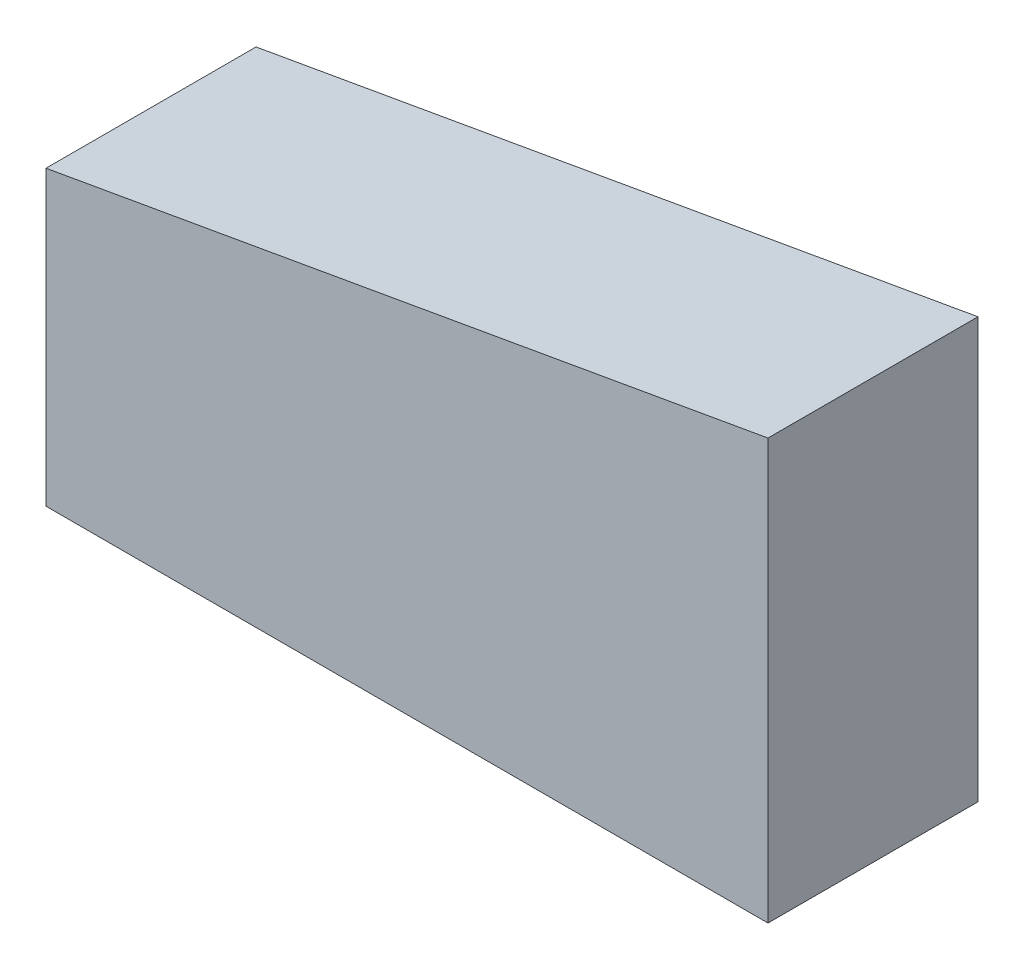
ISO-10303-21;
HEADER;
FILE_DESCRIPTION(('STEP AP214'),'2;1');
FILE_NAME('part.step','',(''),(''),'','','');
FILE_SCHEMA(('AUTOMOTIVE_DESIGN { 1 0 10303 214 1 1 1 1 }'));
ENDSEC;
DATA;
#1=APPLICATION_CONTEXT('core data for automotive mechanical design processes');
#2=APPLICATION_PROTOCOL_DEFINITION('international standard','automotive_design',2000,#1);
#3=PRODUCT_CONTEXT('',#1,'mechanical');
#4=PRODUCT('Part','Part','',(#3));
#5=PRODUCT_RELATED_PRODUCT_CATEGORY('part','',(#4));
#6=PRODUCT_DEFINITION_FORMATION('','',#4);
#7=PRODUCT_DEFINITION_CONTEXT('part definition',#1,'design');
#8=PRODUCT_DEFINITION('design','',#6,#7);
#9=PRODUCT_DEFINITION_SHAPE('','',#8);
#10=(LENGTH_UNIT() NAMED_UNIT(*) SI_UNIT(.MILLI.,.METRE.));
#11=(NAMED_UNIT(*) PLANE_ANGLE_UNIT() SI_UNIT($,.RADIAN.));
#12=(NAMED_UNIT(*) SI_UNIT($,.STERADIAN.) SOLID_ANGLE_UNIT());
#13=UNCERTAINTY_MEASURE_WITH_UNIT(LENGTH_MEASURE(1.E-05),#10,'distance_accuracy_value','');
#14=(GEOMETRIC_REPRESENTATION_CONTEXT(3) GLOBAL_UNCERTAINTY_ASSIGNED_CONTEXT((#13)) GLOBAL_UNIT_ASSIGNED_CONTEXT((#10,
#11,#12)) REPRESENTATION_CONTEXT('',''));
#15=CARTESIAN_POINT('',(0.,0.,0.));
#16=DIRECTION('',(0.,0.,1.));
#17=DIRECTION('',(1.,0.,0.));
#18=AXIS2_PLACEMENT_3D('',#15,#16,#17);
#19=CARTESIAN_POINT('',(27.5,0.,8.));
#20=DIRECTION('',(-1.,0.,0.));
#21=DIRECTION('',(0.,0.,1.));
#22=AXIS2_PLACEMENT_3D('',#19,#20,#21);
#23=PLANE('',#22);
#24=DIRECTION('',(0.,1.,0.));
#25=VECTOR('',#24,1.);
#26=CARTESIAN_POINT('',(27.5,0.,-8.));
#27=LINE('',#26,#25);
#28=CARTESIAN_POINT('',(27.5,0.,-8.));
#29=VERTEX_POINT('',#28);
#30=CARTESIAN_POINT('',(27.5,32.,-8.));
#31=VERTEX_POINT('',#30);
#32=EDGE_CURVE('E96',#29,#31,#27,.T.);
#33=ORIENTED_EDGE('',*,*,#32,.T.);
#34=DIRECTION('',(0.,0.,-1.));
#35=VECTOR('',#34,1.);
#36=CARTESIAN_POINT('',(27.5,32.,8.));
#37=LINE('',#36,#35);
#38=CARTESIAN_POINT('',(27.5,32.,8.));
#39=VERTEX_POINT('',#38);
#40=EDGE_CURVE('E11',#39,#31,#37,.T.);
#41=ORIENTED_EDGE('',*,*,#40,.F.);
#42=DIRECTION('',(0.,1.,0.));
#43=VECTOR('',#42,1.);
#44=CARTESIAN_POINT('',(27.5,0.,8.));
#45=LINE('',#44,#43);
#46=CARTESIAN_POINT('',(27.5,0.,8.));
#47=VERTEX_POINT('',#46);
#48=EDGE_CURVE('E84',#47,#39,#45,.T.);
#49=ORIENTED_EDGE('',*,*,#48,.F.);
#50=DIRECTION('',(0.,0.,-1.));
#51=VECTOR('',#50,1.);
#52=CARTESIAN_POINT('',(27.5,0.,8.));
#53=LINE('',#52,#51);
#54=EDGE_CURVE('E92',#47,#29,#53,.T.);
#55=ORIENTED_EDGE('',*,*,#54,.T.);
#56=EDGE_LOOP('',(#33,#41,#49,#55));
#57=FACE_BOUND('',#56,.T.);
#58=ADVANCED_FACE('F33',(#57),#23,.F.);
#59=CARTESIAN_POINT('',(27.5,32.,8.));
#60=DIRECTION('',(0.173648177666927,-0.984807753012209,0.));
#61=DIRECTION('',(0.984807753012209,0.173648177666927,0.));
#62=AXIS2_PLACEMENT_3D('',#59,#60,#61);
#63=PLANE('',#62);
#64=DIRECTION('',(-0.984807753012209,-0.173648177666927,0.));
#65=VECTOR('',#64,1.);
#66=CARTESIAN_POINT('',(27.5,32.,-8.));
#67=LINE('',#66,#65);
#68=CARTESIAN_POINT('',(-27.5,22.3020160610346,-8.));
#69=VERTEX_POINT('',#68);
#70=EDGE_CURVE('E88',#31,#69,#67,.T.);
#71=ORIENTED_EDGE('',*,*,#70,.T.);
#72=DIRECTION('',(0.,0.,-1.));
#73=VECTOR('',#72,1.);
#74=CARTESIAN_POINT('',(-27.5,22.3020160610346,8.));
#75=LINE('',#74,#73);
#76=CARTESIAN_POINT('',(-27.5,22.3020160610346,8.));
#77=VERTEX_POINT('',#76);
#78=EDGE_CURVE('E41',#77,#69,#75,.T.);
#79=ORIENTED_EDGE('',*,*,#78,.F.);
#80=DIRECTION('',(-0.984807753012209,-0.173648177666927,0.));
#81=VECTOR('',#80,1.);
#82=CARTESIAN_POINT('',(27.5,32.,8.));
#83=LINE('',#82,#81);
#84=EDGE_CURVE('E79',#39,#77,#83,.T.);
#85=ORIENTED_EDGE('',*,*,#84,.F.);
#86=ORIENTED_EDGE('',*,*,#40,.T.);
#87=EDGE_LOOP('',(#71,#79,#85,#86));
#88=FACE_BOUND('',#87,.T.);
#89=ADVANCED_FACE('F87',(#88),#63,.F.);
#90=CARTESIAN_POINT('',(-27.5,22.3020160610346,8.));
#91=DIRECTION('',(1.,0.,0.));
#92=DIRECTION('',(0.,0.,-1.));
#93=AXIS2_PLACEMENT_3D('',#90,#91,#92);
#94=PLANE('',#93);
#95=DIRECTION('',(0.,-1.,0.));
#96=VECTOR('',#95,1.);
#97=CARTESIAN_POINT('',(-27.5,22.3020160610346,-8.));
#98=LINE('',#97,#96);
#99=CARTESIAN_POINT('',(-27.5,0.,-8.));
#100=VERTEX_POINT('',#99);
#101=EDGE_CURVE('E66',#69,#100,#98,.T.);
#102=ORIENTED_EDGE('',*,*,#101,.T.);
#103=DIRECTION('',(0.,0.,-1.));
#104=VECTOR('',#103,1.);
#105=CARTESIAN_POINT('',(-27.5,0.,8.));
#106=LINE('',#105,#104);
#107=CARTESIAN_POINT('',(-27.5,0.,8.));
#108=VERTEX_POINT('',#107);
#109=EDGE_CURVE('E89',#108,#100,#106,.T.);
#110=ORIENTED_EDGE('',*,*,#109,.F.);
#111=DIRECTION('',(0.,-1.,0.));
#112=VECTOR('',#111,1.);
#113=CARTESIAN_POINT('',(-27.5,22.3020160610346,8.));
#114=LINE('',#113,#112);
#115=EDGE_CURVE('E82',#77,#108,#114,.T.);
#116=ORIENTED_EDGE('',*,*,#115,.F.);
#117=ORIENTED_EDGE('',*,*,#78,.T.);
#118=EDGE_LOOP('',(#102,#110,#116,#117));
#119=FACE_BOUND('',#118,.T.);
#120=ADVANCED_FACE('F90',(#119),#94,.F.);
#121=CARTESIAN_POINT('',(-27.5,0.,8.));
#122=DIRECTION('',(0.,1.,0.));
#123=DIRECTION('',(0.,0.,1.));
#124=AXIS2_PLACEMENT_3D('',#121,#122,#123);
#125=PLANE('',#124);
#126=DIRECTION('',(1.,0.,0.));
#127=VECTOR('',#126,1.);
#128=CARTESIAN_POINT('',(-27.5,0.,-8.));
#129=LINE('',#128,#127);
#130=EDGE_CURVE('E72',#100,#29,#129,.T.);
#131=ORIENTED_EDGE('',*,*,#130,.T.);
#132=ORIENTED_EDGE('',*,*,#54,.F.);
#133=DIRECTION('',(1.,0.,0.));
#134=VECTOR('',#133,1.);
#135=CARTESIAN_POINT('',(-27.5,0.,8.));
#136=LINE('',#135,#134);
#137=EDGE_CURVE('E49',#108,#47,#136,.T.);
#138=ORIENTED_EDGE('',*,*,#137,.F.);
#139=ORIENTED_EDGE('',*,*,#109,.T.);
#140=EDGE_LOOP('',(#131,#132,#138,#139));
#141=FACE_BOUND('',#140,.T.);
#142=ADVANCED_FACE('F103',(#141),#125,.F.);
#143=CARTESIAN_POINT('',(0.,0.,8.));
#144=DIRECTION('',(0.,0.,-1.));
#145=DIRECTION('',(-1.,0.,0.));
#146=AXIS2_PLACEMENT_3D('',#143,#144,#145);
#147=PLANE('',#146);
#148=ORIENTED_EDGE('',*,*,#48,.T.);
#149=ORIENTED_EDGE('',*,*,#84,.T.);
#150=ORIENTED_EDGE('',*,*,#115,.T.);
#151=ORIENTED_EDGE('',*,*,#137,.T.);
#152=EDGE_LOOP('',(#148,#149,#150,#151));
#153=FACE_BOUND('',#152,.T.);
#154=ADVANCED_FACE('F80',(#153),#147,.F.);
#155=CARTESIAN_POINT('',(0.,0.,-8.));
#156=DIRECTION('',(0.,0.,-1.));
#157=DIRECTION('',(-1.,0.,0.));
#158=AXIS2_PLACEMENT_3D('',#155,#156,#157);
#159=PLANE('',#158);
#160=ORIENTED_EDGE('',*,*,#32,.F.);
#161=ORIENTED_EDGE('',*,*,#130,.F.);
#162=ORIENTED_EDGE('',*,*,#101,.F.);
#163=ORIENTED_EDGE('',*,*,#70,.F.);
#164=EDGE_LOOP('',(#160,#161,#162,#163));
#165=FACE_BOUND('',#164,.T.);
#166=ADVANCED_FACE('F106',(#165),#159,.T.);
#167=CLOSED_SHELL('',(#58,#89,#120,#142,#154,#166));
#168=MANIFOLD_SOLID_BREP('B2',#167);
#169=ADVANCED_BREP_SHAPE_REPRESENTATION('',(#18,#168),#14);
#170=SHAPE_DEFINITION_REPRESENTATION(#9,#169);
ENDSEC;
END-ISO-10303-21;
